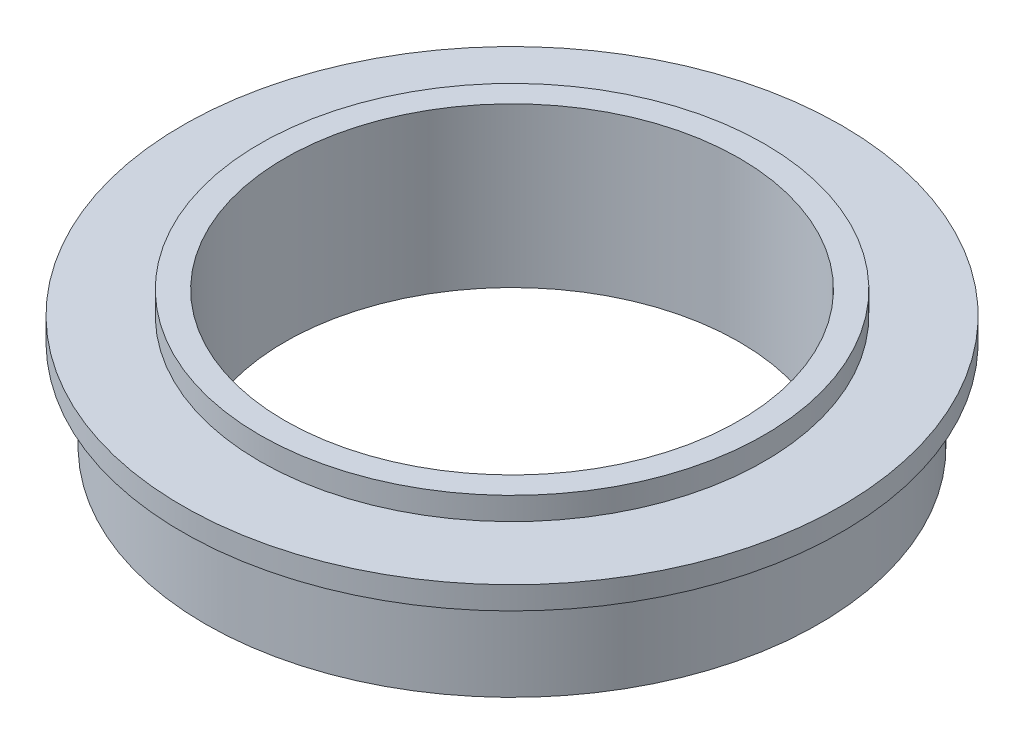
ISO-10303-21;
HEADER;
FILE_DESCRIPTION(('STEP AP214'),'2;1');
FILE_NAME('part.step','',(''),(''),'','','');
FILE_SCHEMA(('AUTOMOTIVE_DESIGN { 1 0 10303 214 1 1 1 1 }'));
ENDSEC;
DATA;
#1=APPLICATION_CONTEXT('core data for automotive mechanical design processes');
#2=APPLICATION_PROTOCOL_DEFINITION('international standard','automotive_design',2000,#1);
#3=PRODUCT_CONTEXT('',#1,'mechanical');
#4=PRODUCT('Part','Part','',(#3));
#5=PRODUCT_RELATED_PRODUCT_CATEGORY('part','',(#4));
#6=PRODUCT_DEFINITION_FORMATION('','',#4);
#7=PRODUCT_DEFINITION_CONTEXT('part definition',#1,'design');
#8=PRODUCT_DEFINITION('design','',#6,#7);
#9=PRODUCT_DEFINITION_SHAPE('','',#8);
#10=(LENGTH_UNIT() NAMED_UNIT(*) SI_UNIT(.MILLI.,.METRE.));
#11=(NAMED_UNIT(*) PLANE_ANGLE_UNIT() SI_UNIT($,.RADIAN.));
#12=(NAMED_UNIT(*) SI_UNIT($,.STERADIAN.) SOLID_ANGLE_UNIT());
#13=UNCERTAINTY_MEASURE_WITH_UNIT(LENGTH_MEASURE(1.E-05),#10,'distance_accuracy_value','');
#14=(GEOMETRIC_REPRESENTATION_CONTEXT(3) GLOBAL_UNCERTAINTY_ASSIGNED_CONTEXT((#13)) GLOBAL_UNIT_ASSIGNED_CONTEXT((#10,
#11,#12)) REPRESENTATION_CONTEXT('',''));
#15=CARTESIAN_POINT('',(0.,0.,0.));
#16=DIRECTION('',(0.,0.,1.));
#17=DIRECTION('',(1.,0.,0.));
#18=AXIS2_PLACEMENT_3D('',#15,#16,#17);
#19=CARTESIAN_POINT('',(0.,0.,0.));
#20=DIRECTION('',(0.,-1.,0.));
#21=DIRECTION('',(0.,0.,-1.));
#22=AXIS2_PLACEMENT_3D('',#19,#20,#21);
#23=CYLINDRICAL_SURFACE('',#22,13.5);
#24=CARTESIAN_POINT('',(0.,4.,0.));
#25=DIRECTION('',(0.,-1.,0.));
#26=DIRECTION('',(0.,0.,-1.));
#27=AXIS2_PLACEMENT_3D('',#24,#25,#26);
#28=CIRCLE('',#27,13.5);
#29=CARTESIAN_POINT('',(0.,4.,-13.5));
#30=VERTEX_POINT('',#29);
#31=EDGE_CURVE('E67',#30,#30,#28,.T.);
#32=ORIENTED_EDGE('',*,*,#31,.T.);
#33=EDGE_LOOP('',(#32));
#34=FACE_BOUND('',#33,.T.);
#35=CARTESIAN_POINT('',(0.,0.,0.));
#36=DIRECTION('',(0.,-1.,0.));
#37=DIRECTION('',(0.,0.,-1.));
#38=AXIS2_PLACEMENT_3D('',#35,#36,#37);
#39=CIRCLE('',#38,13.5);
#40=CARTESIAN_POINT('',(0.,0.,-13.5));
#41=VERTEX_POINT('',#40);
#42=EDGE_CURVE('E10',#41,#41,#39,.T.);
#43=ORIENTED_EDGE('',*,*,#42,.F.);
#44=EDGE_LOOP('',(#43));
#45=FACE_BOUND('',#44,.T.);
#46=ADVANCED_FACE('F33',(#34,#45),#23,.T.);
#47=CARTESIAN_POINT('',(11.1,0.,0.));
#48=DIRECTION('',(0.,-1.,0.));
#49=DIRECTION('',(0.,0.,-1.));
#50=AXIS2_PLACEMENT_3D('',#47,#48,#49);
#51=PLANE('',#50);
#52=ORIENTED_EDGE('',*,*,#42,.T.);
#53=EDGE_LOOP('',(#52));
#54=FACE_BOUND('',#53,.T.);
#55=CARTESIAN_POINT('',(0.,0.,0.));
#56=DIRECTION('',(0.,-1.,0.));
#57=DIRECTION('',(0.,0.,-1.));
#58=AXIS2_PLACEMENT_3D('',#55,#56,#57);
#59=CIRCLE('',#58,11.1);
#60=CARTESIAN_POINT('',(0.,0.,-11.1));
#61=VERTEX_POINT('',#60);
#62=EDGE_CURVE('E39',#61,#61,#59,.T.);
#63=ORIENTED_EDGE('',*,*,#62,.F.);
#64=EDGE_LOOP('',(#63));
#65=FACE_BOUND('',#64,.T.);
#66=ADVANCED_FACE('F85',(#54,#65),#51,.T.);
#67=CARTESIAN_POINT('',(0.,0.,0.));
#68=DIRECTION('',(0.,-1.,0.));
#69=DIRECTION('',(0.,0.,-1.));
#70=AXIS2_PLACEMENT_3D('',#67,#68,#69);
#71=CYLINDRICAL_SURFACE('',#70,11.1);
#72=ORIENTED_EDGE('',*,*,#62,.T.);
#73=EDGE_LOOP('',(#72));
#74=FACE_BOUND('',#73,.T.);
#75=CARTESIAN_POINT('',(0.,-1.,0.));
#76=DIRECTION('',(0.,-1.,0.));
#77=DIRECTION('',(0.,0.,-1.));
#78=AXIS2_PLACEMENT_3D('',#75,#76,#77);
#79=CIRCLE('',#78,11.1);
#80=CARTESIAN_POINT('',(0.,-1.,-11.1));
#81=VERTEX_POINT('',#80);
#82=EDGE_CURVE('E43',#81,#81,#79,.T.);
#83=ORIENTED_EDGE('',*,*,#82,.F.);
#84=EDGE_LOOP('',(#83));
#85=FACE_BOUND('',#84,.T.);
#86=ADVANCED_FACE('F89',(#74,#85),#71,.T.);
#87=CARTESIAN_POINT('',(11.1,-1.,0.));
#88=DIRECTION('',(0.,-1.,0.));
#89=DIRECTION('',(0.,0.,-1.));
#90=AXIS2_PLACEMENT_3D('',#87,#88,#89);
#91=PLANE('',#90);
#92=ORIENTED_EDGE('',*,*,#82,.T.);
#93=EDGE_LOOP('',(#92));
#94=FACE_BOUND('',#93,.T.);
#95=CARTESIAN_POINT('',(0.,-1.,0.));
#96=DIRECTION('',(0.,-1.,0.));
#97=DIRECTION('',(0.,0.,-1.));
#98=AXIS2_PLACEMENT_3D('',#95,#96,#97);
#99=CIRCLE('',#98,10.);
#100=CARTESIAN_POINT('',(0.,-1.,-10.));
#101=VERTEX_POINT('',#100);
#102=EDGE_CURVE('E47',#101,#101,#99,.T.);
#103=ORIENTED_EDGE('',*,*,#102,.F.);
#104=EDGE_LOOP('',(#103));
#105=FACE_BOUND('',#104,.T.);
#106=ADVANCED_FACE('F93',(#94,#105),#91,.T.);
#107=CARTESIAN_POINT('',(0.,0.,0.));
#108=DIRECTION('',(0.,-1.,0.));
#109=DIRECTION('',(0.,0.,-1.));
#110=AXIS2_PLACEMENT_3D('',#107,#108,#109);
#111=CYLINDRICAL_SURFACE('',#110,10.);
#112=ORIENTED_EDGE('',*,*,#102,.T.);
#113=EDGE_LOOP('',(#112));
#114=FACE_BOUND('',#113,.T.);
#115=CARTESIAN_POINT('',(0.,6.,0.));
#116=DIRECTION('',(0.,-1.,0.));
#117=DIRECTION('',(0.,0.,-1.));
#118=AXIS2_PLACEMENT_3D('',#115,#116,#117);
#119=CIRCLE('',#118,10.);
#120=CARTESIAN_POINT('',(0.,6.,-10.));
#121=VERTEX_POINT('',#120);
#122=EDGE_CURVE('E52',#121,#121,#119,.T.);
#123=ORIENTED_EDGE('',*,*,#122,.F.);
#124=EDGE_LOOP('',(#123));
#125=FACE_BOUND('',#124,.T.);
#126=ADVANCED_FACE('F99',(#114,#125),#111,.F.);
#127=CARTESIAN_POINT('',(11.1,6.,0.));
#128=DIRECTION('',(0.,1.,0.));
#129=DIRECTION('',(0.,0.,1.));
#130=AXIS2_PLACEMENT_3D('',#127,#128,#129);
#131=PLANE('',#130);
#132=ORIENTED_EDGE('',*,*,#122,.T.);
#133=EDGE_LOOP('',(#132));
#134=FACE_BOUND('',#133,.T.);
#135=CARTESIAN_POINT('',(0.,6.,0.));
#136=DIRECTION('',(0.,-1.,0.));
#137=DIRECTION('',(0.,0.,-1.));
#138=AXIS2_PLACEMENT_3D('',#135,#136,#137);
#139=CIRCLE('',#138,11.1);
#140=CARTESIAN_POINT('',(0.,6.,-11.1));
#141=VERTEX_POINT('',#140);
#142=EDGE_CURVE('E55',#141,#141,#139,.T.);
#143=ORIENTED_EDGE('',*,*,#142,.F.);
#144=EDGE_LOOP('',(#143));
#145=FACE_BOUND('',#144,.T.);
#146=ADVANCED_FACE('F103',(#134,#145),#131,.T.);
#147=CARTESIAN_POINT('',(0.,0.,0.));
#148=DIRECTION('',(0.,-1.,0.));
#149=DIRECTION('',(0.,0.,-1.));
#150=AXIS2_PLACEMENT_3D('',#147,#148,#149);
#151=CYLINDRICAL_SURFACE('',#150,11.1);
#152=ORIENTED_EDGE('',*,*,#142,.T.);
#153=EDGE_LOOP('',(#152));
#154=FACE_BOUND('',#153,.T.);
#155=CARTESIAN_POINT('',(0.,5.,0.));
#156=DIRECTION('',(0.,-1.,0.));
#157=DIRECTION('',(0.,0.,-1.));
#158=AXIS2_PLACEMENT_3D('',#155,#156,#157);
#159=CIRCLE('',#158,11.1);
#160=CARTESIAN_POINT('',(0.,5.,-11.1));
#161=VERTEX_POINT('',#160);
#162=EDGE_CURVE('E58',#161,#161,#159,.T.);
#163=ORIENTED_EDGE('',*,*,#162,.F.);
#164=EDGE_LOOP('',(#163));
#165=FACE_BOUND('',#164,.T.);
#166=ADVANCED_FACE('F107',(#154,#165),#151,.T.);
#167=CARTESIAN_POINT('',(14.5,5.,0.));
#168=DIRECTION('',(0.,1.,0.));
#169=DIRECTION('',(0.,0.,1.));
#170=AXIS2_PLACEMENT_3D('',#167,#168,#169);
#171=PLANE('',#170);
#172=ORIENTED_EDGE('',*,*,#162,.T.);
#173=EDGE_LOOP('',(#172));
#174=FACE_BOUND('',#173,.T.);
#175=CARTESIAN_POINT('',(0.,5.,0.));
#176=DIRECTION('',(0.,-1.,0.));
#177=DIRECTION('',(0.,0.,-1.));
#178=AXIS2_PLACEMENT_3D('',#175,#176,#177);
#179=CIRCLE('',#178,14.5);
#180=CARTESIAN_POINT('',(0.,5.,-14.5));
#181=VERTEX_POINT('',#180);
#182=EDGE_CURVE('E61',#181,#181,#179,.T.);
#183=ORIENTED_EDGE('',*,*,#182,.F.);
#184=EDGE_LOOP('',(#183));
#185=FACE_BOUND('',#184,.T.);
#186=ADVANCED_FACE('F81',(#174,#185),#171,.T.);
#187=CARTESIAN_POINT('',(0.,0.,0.));
#188=DIRECTION('',(0.,-1.,0.));
#189=DIRECTION('',(0.,0.,-1.));
#190=AXIS2_PLACEMENT_3D('',#187,#188,#189);
#191=CYLINDRICAL_SURFACE('',#190,14.5);
#192=ORIENTED_EDGE('',*,*,#182,.T.);
#193=EDGE_LOOP('',(#192));
#194=FACE_BOUND('',#193,.T.);
#195=CARTESIAN_POINT('',(0.,4.,0.));
#196=DIRECTION('',(0.,-1.,0.));
#197=DIRECTION('',(0.,0.,-1.));
#198=AXIS2_PLACEMENT_3D('',#195,#196,#197);
#199=CIRCLE('',#198,14.5);
#200=CARTESIAN_POINT('',(0.,4.,-14.5));
#201=VERTEX_POINT('',#200);
#202=EDGE_CURVE('E64',#201,#201,#199,.T.);
#203=ORIENTED_EDGE('',*,*,#202,.F.);
#204=EDGE_LOOP('',(#203));
#205=FACE_BOUND('',#204,.T.);
#206=ADVANCED_FACE('F75',(#194,#205),#191,.T.);
#207=CARTESIAN_POINT('',(13.5,4.,0.));
#208=DIRECTION('',(0.,-1.,0.));
#209=DIRECTION('',(0.,0.,-1.));
#210=AXIS2_PLACEMENT_3D('',#207,#208,#209);
#211=PLANE('',#210);
#212=ORIENTED_EDGE('',*,*,#202,.T.);
#213=EDGE_LOOP('',(#212));
#214=FACE_BOUND('',#213,.T.);
#215=ORIENTED_EDGE('',*,*,#31,.F.);
#216=EDGE_LOOP('',(#215));
#217=FACE_BOUND('',#216,.T.);
#218=ADVANCED_FACE('F73',(#214,#217),#211,.T.);
#219=CLOSED_SHELL('',(#46,#66,#86,#106,#126,#146,#166,#186,#206,#218));
#220=MANIFOLD_SOLID_BREP('B2',#219);
#221=ADVANCED_BREP_SHAPE_REPRESENTATION('',(#18,#220),#14);
#222=SHAPE_DEFINITION_REPRESENTATION(#9,#221);
ENDSEC;
END-ISO-10303-21;
